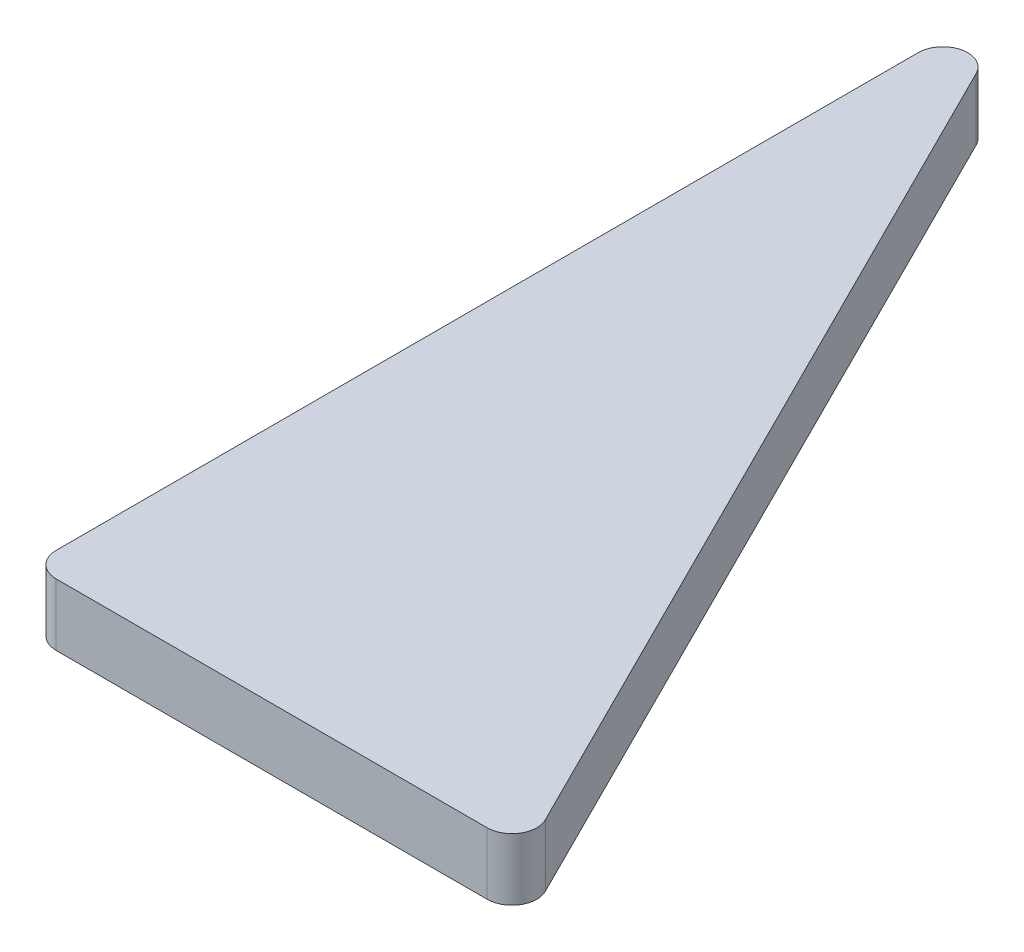
ISO-10303-21;
HEADER;
FILE_DESCRIPTION(('STEP AP214'),'2;1');
FILE_NAME('part.step','',(''),(''),'','','');
FILE_SCHEMA(('AUTOMOTIVE_DESIGN { 1 0 10303 214 1 1 1 1 }'));
ENDSEC;
DATA;
#1=APPLICATION_CONTEXT('core data for automotive mechanical design processes');
#2=APPLICATION_PROTOCOL_DEFINITION('international standard','automotive_design',2000,#1);
#3=PRODUCT_CONTEXT('',#1,'mechanical');
#4=PRODUCT('Part','Part','',(#3));
#5=PRODUCT_RELATED_PRODUCT_CATEGORY('part','',(#4));
#6=PRODUCT_DEFINITION_FORMATION('','',#4);
#7=PRODUCT_DEFINITION_CONTEXT('part definition',#1,'design');
#8=PRODUCT_DEFINITION('design','',#6,#7);
#9=PRODUCT_DEFINITION_SHAPE('','',#8);
#10=(LENGTH_UNIT() NAMED_UNIT(*) SI_UNIT(.MILLI.,.METRE.));
#11=(NAMED_UNIT(*) PLANE_ANGLE_UNIT() SI_UNIT($,.RADIAN.));
#12=(NAMED_UNIT(*) SI_UNIT($,.STERADIAN.) SOLID_ANGLE_UNIT());
#13=UNCERTAINTY_MEASURE_WITH_UNIT(LENGTH_MEASURE(1.E-05),#10,'distance_accuracy_value','');
#14=(GEOMETRIC_REPRESENTATION_CONTEXT(3) GLOBAL_UNCERTAINTY_ASSIGNED_CONTEXT((#13)) GLOBAL_UNIT_ASSIGNED_CONTEXT((#10,
#11,#12)) REPRESENTATION_CONTEXT('',''));
#15=CARTESIAN_POINT('',(0.,0.,0.));
#16=DIRECTION('',(0.,0.,1.));
#17=DIRECTION('',(1.,0.,0.));
#18=AXIS2_PLACEMENT_3D('',#15,#16,#17);
#19=CARTESIAN_POINT('',(0.,0.,0.));
#20=DIRECTION('',(0.,1.,0.));
#21=DIRECTION('',(0.,0.,1.));
#22=AXIS2_PLACEMENT_3D('',#19,#20,#21);
#23=PLANE('',#22);
#24=CARTESIAN_POINT('',(59.3901936685753,0.,-15.24));
#25=DIRECTION('',(0.,1.,0.));
#26=DIRECTION('',(0.,0.,1.));
#27=AXIS2_PLACEMENT_3D('',#24,#25,#26);
#28=CIRCLE('',#27,2.54);
#29=CARTESIAN_POINT('',(59.3901936685752,0.,-12.7));
#30=VERTEX_POINT('',#29);
#31=CARTESIAN_POINT('',(61.6620387337151,0.,-16.3759225325699));
#32=VERTEX_POINT('',#31);
#33=EDGE_CURVE('E39',#30,#32,#28,.T.);
#34=ORIENTED_EDGE('',*,*,#33,.F.);
#35=DIRECTION('',(1.,0.,0.));
#36=VECTOR('',#35,1.);
#37=CARTESIAN_POINT('',(15.24,0.,-12.7));
#38=LINE('',#37,#36);
#39=CARTESIAN_POINT('',(15.24,0.,-12.7));
#40=VERTEX_POINT('',#39);
#41=EDGE_CURVE('E103',#40,#30,#38,.T.);
#42=ORIENTED_EDGE('',*,*,#41,.F.);
#43=CARTESIAN_POINT('',(15.24,0.,-15.24));
#44=DIRECTION('',(0.,1.,0.));
#45=DIRECTION('',(0.,0.,-1.));
#46=AXIS2_PLACEMENT_3D('',#43,#44,#45);
#47=CIRCLE('',#46,2.54);
#48=CARTESIAN_POINT('',(12.7,0.,-15.24));
#49=VERTEX_POINT('',#48);
#50=EDGE_CURVE('E86',#49,#40,#47,.T.);
#51=ORIENTED_EDGE('',*,*,#50,.F.);
#52=DIRECTION('',(0.,0.,1.));
#53=VECTOR('',#52,1.);
#54=CARTESIAN_POINT('',(12.7,0.,-15.24));
#55=LINE('',#54,#53);
#56=CARTESIAN_POINT('',(12.7,0.,-103.54038733715));
#57=VERTEX_POINT('',#56);
#58=EDGE_CURVE('E91',#57,#49,#55,.T.);
#59=ORIENTED_EDGE('',*,*,#58,.F.);
#60=CARTESIAN_POINT('',(15.24,0.,-103.540387337151));
#61=DIRECTION('',(0.,1.,0.));
#62=DIRECTION('',(0.,0.,1.));
#63=AXIS2_PLACEMENT_3D('',#60,#61,#62);
#64=CIRCLE('',#63,2.54);
#65=CARTESIAN_POINT('',(17.5118450651398,0.,-104.67630986972));
#66=VERTEX_POINT('',#65);
#67=EDGE_CURVE('E110',#66,#57,#64,.T.);
#68=ORIENTED_EDGE('',*,*,#67,.F.);
#69=DIRECTION('',(-0.447213595499958,0.,-0.894427190999916));
#70=VECTOR('',#69,1.);
#71=CARTESIAN_POINT('',(17.5118450651399,0.,-104.67630986972));
#72=LINE('',#71,#70);
#73=EDGE_CURVE('E112',#32,#66,#72,.T.);
#74=ORIENTED_EDGE('',*,*,#73,.F.);
#75=EDGE_LOOP('',(#34,#42,#51,#59,#68,#74));
#76=FACE_BOUND('',#75,.T.);
#77=ADVANCED_FACE('F35',(#76),#23,.F.);
#78=CARTESIAN_POINT('',(17.5118450651399,0.,-104.67630986972));
#79=DIRECTION('',(0.894427190999916,0.,-0.447213595499958));
#80=DIRECTION('',(-0.447213595499958,0.,-0.894427190999916));
#81=AXIS2_PLACEMENT_3D('',#78,#79,#80);
#82=PLANE('',#81);
#83=DIRECTION('',(-0.447213595499958,0.,-0.894427190999916));
#84=VECTOR('',#83,1.);
#85=CARTESIAN_POINT('',(17.5118450651399,6.35,-104.67630986972));
#86=LINE('',#85,#84);
#87=CARTESIAN_POINT('',(61.662038733715,6.35,-16.3759225325699));
#88=VERTEX_POINT('',#87);
#89=CARTESIAN_POINT('',(17.5118450651399,6.35,-104.67630986972));
#90=VERTEX_POINT('',#89);
#91=EDGE_CURVE('E134',#88,#90,#86,.T.);
#92=ORIENTED_EDGE('',*,*,#91,.F.);
#93=DIRECTION('',(0.,1.,0.));
#94=VECTOR('',#93,1.);
#95=CARTESIAN_POINT('',(61.662038733715,0.,-16.3759225325699));
#96=LINE('',#95,#94);
#97=EDGE_CURVE('E54',#32,#88,#96,.T.);
#98=ORIENTED_EDGE('',*,*,#97,.F.);
#99=ORIENTED_EDGE('',*,*,#73,.T.);
#100=DIRECTION('',(0.,1.,0.));
#101=VECTOR('',#100,1.);
#102=CARTESIAN_POINT('',(17.5118450651399,0.,-104.67630986972));
#103=LINE('',#102,#101);
#104=EDGE_CURVE('E111',#66,#90,#103,.T.);
#105=ORIENTED_EDGE('',*,*,#104,.T.);
#106=EDGE_LOOP('',(#92,#98,#99,#105));
#107=FACE_BOUND('',#106,.T.);
#108=ADVANCED_FACE('F146',(#107),#82,.T.);
#109=CARTESIAN_POINT('',(15.24,0.,-103.540387337151));
#110=DIRECTION('',(0.,1.,0.));
#111=DIRECTION('',(0.,0.,1.));
#112=AXIS2_PLACEMENT_3D('',#109,#110,#111);
#113=CYLINDRICAL_SURFACE('',#112,2.54);
#114=CARTESIAN_POINT('',(15.24,6.35,-103.540387337151));
#115=DIRECTION('',(0.,1.,0.));
#116=DIRECTION('',(0.,0.,1.));
#117=AXIS2_PLACEMENT_3D('',#114,#115,#116);
#118=CIRCLE('',#117,2.54);
#119=CARTESIAN_POINT('',(12.7,6.35,-103.54038733715));
#120=VERTEX_POINT('',#119);
#121=EDGE_CURVE('E131',#90,#120,#118,.T.);
#122=ORIENTED_EDGE('',*,*,#121,.F.);
#123=ORIENTED_EDGE('',*,*,#104,.F.);
#124=ORIENTED_EDGE('',*,*,#67,.T.);
#125=DIRECTION('',(0.,1.,0.));
#126=VECTOR('',#125,1.);
#127=CARTESIAN_POINT('',(12.7,0.,-103.54038733715));
#128=LINE('',#127,#126);
#129=EDGE_CURVE('E96',#57,#120,#128,.T.);
#130=ORIENTED_EDGE('',*,*,#129,.T.);
#131=EDGE_LOOP('',(#122,#123,#124,#130));
#132=FACE_BOUND('',#131,.T.);
#133=ADVANCED_FACE('F143',(#132),#113,.T.);
#134=CARTESIAN_POINT('',(12.7,0.,-15.24));
#135=DIRECTION('',(-1.,0.,0.));
#136=DIRECTION('',(0.,0.,1.));
#137=AXIS2_PLACEMENT_3D('',#134,#135,#136);
#138=PLANE('',#137);
#139=DIRECTION('',(0.,0.,1.));
#140=VECTOR('',#139,1.);
#141=CARTESIAN_POINT('',(12.7,6.35,-15.24));
#142=LINE('',#141,#140);
#143=CARTESIAN_POINT('',(12.7,6.35,-15.24));
#144=VERTEX_POINT('',#143);
#145=EDGE_CURVE('E45',#120,#144,#142,.T.);
#146=ORIENTED_EDGE('',*,*,#145,.F.);
#147=ORIENTED_EDGE('',*,*,#129,.F.);
#148=ORIENTED_EDGE('',*,*,#58,.T.);
#149=DIRECTION('',(0.,1.,0.));
#150=VECTOR('',#149,1.);
#151=CARTESIAN_POINT('',(12.7,0.,-15.24));
#152=LINE('',#151,#150);
#153=EDGE_CURVE('E82',#49,#144,#152,.T.);
#154=ORIENTED_EDGE('',*,*,#153,.T.);
#155=EDGE_LOOP('',(#146,#147,#148,#154));
#156=FACE_BOUND('',#155,.T.);
#157=ADVANCED_FACE('F95',(#156),#138,.T.);
#158=CARTESIAN_POINT('',(15.24,0.,-15.24));
#159=DIRECTION('',(0.,1.,0.));
#160=DIRECTION('',(0.,0.,1.));
#161=AXIS2_PLACEMENT_3D('',#158,#159,#160);
#162=CYLINDRICAL_SURFACE('',#161,2.54);
#163=CARTESIAN_POINT('',(15.24,6.35,-15.24));
#164=DIRECTION('',(0.,1.,0.));
#165=DIRECTION('',(0.,0.,-1.));
#166=AXIS2_PLACEMENT_3D('',#163,#164,#165);
#167=CIRCLE('',#166,2.54);
#168=CARTESIAN_POINT('',(15.24,6.35,-12.7));
#169=VERTEX_POINT('',#168);
#170=EDGE_CURVE('E11',#144,#169,#167,.T.);
#171=ORIENTED_EDGE('',*,*,#170,.F.);
#172=ORIENTED_EDGE('',*,*,#153,.F.);
#173=ORIENTED_EDGE('',*,*,#50,.T.);
#174=DIRECTION('',(0.,1.,0.));
#175=VECTOR('',#174,1.);
#176=CARTESIAN_POINT('',(15.24,0.,-12.7));
#177=LINE('',#176,#175);
#178=EDGE_CURVE('E104',#40,#169,#177,.T.);
#179=ORIENTED_EDGE('',*,*,#178,.T.);
#180=EDGE_LOOP('',(#171,#172,#173,#179));
#181=FACE_BOUND('',#180,.T.);
#182=ADVANCED_FACE('F84',(#181),#162,.T.);
#183=CARTESIAN_POINT('',(15.24,0.,-12.7));
#184=DIRECTION('',(0.,0.,1.));
#185=DIRECTION('',(1.,0.,0.));
#186=AXIS2_PLACEMENT_3D('',#183,#184,#185);
#187=PLANE('',#186);
#188=DIRECTION('',(1.,0.,0.));
#189=VECTOR('',#188,1.);
#190=CARTESIAN_POINT('',(15.24,6.35,-12.7));
#191=LINE('',#190,#189);
#192=CARTESIAN_POINT('',(59.3901936685752,6.35,-12.7));
#193=VERTEX_POINT('',#192);
#194=EDGE_CURVE('E126',#169,#193,#191,.T.);
#195=ORIENTED_EDGE('',*,*,#194,.F.);
#196=ORIENTED_EDGE('',*,*,#178,.F.);
#197=ORIENTED_EDGE('',*,*,#41,.T.);
#198=DIRECTION('',(0.,1.,0.));
#199=VECTOR('',#198,1.);
#200=CARTESIAN_POINT('',(59.3901936685752,0.,-12.7));
#201=LINE('',#200,#199);
#202=EDGE_CURVE('E124',#30,#193,#201,.T.);
#203=ORIENTED_EDGE('',*,*,#202,.T.);
#204=EDGE_LOOP('',(#195,#196,#197,#203));
#205=FACE_BOUND('',#204,.T.);
#206=ADVANCED_FACE('F140',(#205),#187,.T.);
#207=CARTESIAN_POINT('',(59.3901936685753,0.,-15.24));
#208=DIRECTION('',(0.,1.,0.));
#209=DIRECTION('',(0.,0.,1.));
#210=AXIS2_PLACEMENT_3D('',#207,#208,#209);
#211=CYLINDRICAL_SURFACE('',#210,2.54);
#212=CARTESIAN_POINT('',(59.3901936685753,6.35,-15.24));
#213=DIRECTION('',(0.,1.,0.));
#214=DIRECTION('',(0.,0.,1.));
#215=AXIS2_PLACEMENT_3D('',#212,#213,#214);
#216=CIRCLE('',#215,2.54);
#217=EDGE_CURVE('E128',#193,#88,#216,.T.);
#218=ORIENTED_EDGE('',*,*,#217,.F.);
#219=ORIENTED_EDGE('',*,*,#202,.F.);
#220=ORIENTED_EDGE('',*,*,#33,.T.);
#221=ORIENTED_EDGE('',*,*,#97,.T.);
#222=EDGE_LOOP('',(#218,#219,#220,#221));
#223=FACE_BOUND('',#222,.T.);
#224=ADVANCED_FACE('F138',(#223),#211,.T.);
#225=CARTESIAN_POINT('',(0.,6.35,0.));
#226=DIRECTION('',(0.,1.,0.));
#227=DIRECTION('',(0.,0.,1.));
#228=AXIS2_PLACEMENT_3D('',#225,#226,#227);
#229=PLANE('',#228);
#230=ORIENTED_EDGE('',*,*,#194,.T.);
#231=ORIENTED_EDGE('',*,*,#217,.T.);
#232=ORIENTED_EDGE('',*,*,#91,.T.);
#233=ORIENTED_EDGE('',*,*,#121,.T.);
#234=ORIENTED_EDGE('',*,*,#145,.T.);
#235=ORIENTED_EDGE('',*,*,#170,.T.);
#236=EDGE_LOOP('',(#230,#231,#232,#233,#234,#235));
#237=FACE_BOUND('',#236,.T.);
#238=ADVANCED_FACE('F37',(#237),#229,.T.);
#239=CLOSED_SHELL('',(#77,#108,#133,#157,#182,#206,#224,#238));
#240=MANIFOLD_SOLID_BREP('B2',#239);
#241=ADVANCED_BREP_SHAPE_REPRESENTATION('',(#18,#240),#14);
#242=SHAPE_DEFINITION_REPRESENTATION(#9,#241);
ENDSEC;
END-ISO-10303-21;
